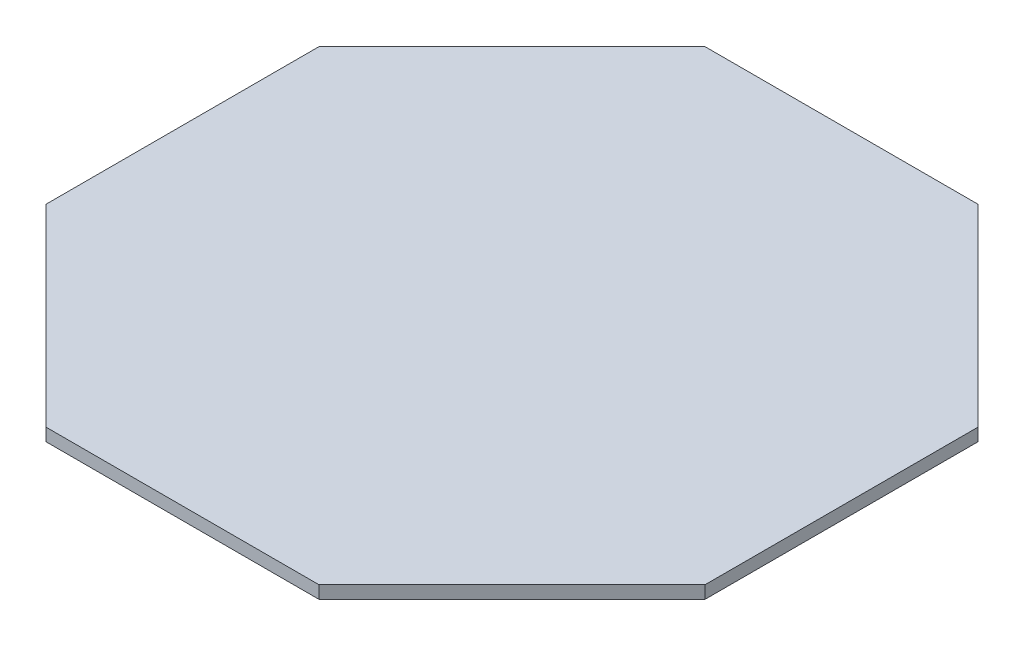
ISO-10303-21;
HEADER;
FILE_DESCRIPTION(('STEP AP214'),'2;1');
FILE_NAME('part.step','',(''),(''),'','','');
FILE_SCHEMA(('AUTOMOTIVE_DESIGN { 1 0 10303 214 1 1 1 1 }'));
ENDSEC;
DATA;
#1=APPLICATION_CONTEXT('core data for automotive mechanical design processes');
#2=APPLICATION_PROTOCOL_DEFINITION('international standard','automotive_design',2000,#1);
#3=PRODUCT_CONTEXT('',#1,'mechanical');
#4=PRODUCT('Part','Part','',(#3));
#5=PRODUCT_RELATED_PRODUCT_CATEGORY('part','',(#4));
#6=PRODUCT_DEFINITION_FORMATION('','',#4);
#7=PRODUCT_DEFINITION_CONTEXT('part definition',#1,'design');
#8=PRODUCT_DEFINITION('design','',#6,#7);
#9=PRODUCT_DEFINITION_SHAPE('','',#8);
#10=(LENGTH_UNIT() NAMED_UNIT(*) SI_UNIT(.MILLI.,.METRE.));
#11=(NAMED_UNIT(*) PLANE_ANGLE_UNIT() SI_UNIT($,.RADIAN.));
#12=(NAMED_UNIT(*) SI_UNIT($,.STERADIAN.) SOLID_ANGLE_UNIT());
#13=UNCERTAINTY_MEASURE_WITH_UNIT(LENGTH_MEASURE(1.E-05),#10,'distance_accuracy_value','');
#14=(GEOMETRIC_REPRESENTATION_CONTEXT(3) GLOBAL_UNCERTAINTY_ASSIGNED_CONTEXT((#13)) GLOBAL_UNIT_ASSIGNED_CONTEXT((#10,
#11,#12)) REPRESENTATION_CONTEXT('',''));
#15=CARTESIAN_POINT('',(0.,0.,0.));
#16=DIRECTION('',(0.,0.,1.));
#17=DIRECTION('',(1.,0.,0.));
#18=AXIS2_PLACEMENT_3D('',#15,#16,#17);
#19=CARTESIAN_POINT('',(78.0000000000003,-3.,32.3086578651015));
#20=DIRECTION('',(1.,0.,0.));
#21=DIRECTION('',(0.,0.,-1.));
#22=AXIS2_PLACEMENT_3D('',#19,#20,#21);
#23=PLANE('',#22);
#24=DIRECTION('',(0.,0.,-1.));
#25=VECTOR('',#24,1.);
#26=CARTESIAN_POINT('',(78.0000000000003,0.,32.3086578651015));
#27=LINE('',#26,#25);
#28=CARTESIAN_POINT('',(78.0000000000003,0.,32.3086578651015));
#29=VERTEX_POINT('',#28);
#30=CARTESIAN_POINT('',(78.0000000000003,0.,-32.3086578651015));
#31=VERTEX_POINT('',#30);
#32=EDGE_CURVE('E130',#29,#31,#27,.T.);
#33=ORIENTED_EDGE('',*,*,#32,.F.);
#34=DIRECTION('',(0.,1.,0.));
#35=VECTOR('',#34,1.);
#36=CARTESIAN_POINT('',(78.0000000000003,-3.,32.3086578651015));
#37=LINE('',#36,#35);
#38=CARTESIAN_POINT('',(78.0000000000003,-3.,32.3086578651015));
#39=VERTEX_POINT('',#38);
#40=EDGE_CURVE('E11',#39,#29,#37,.T.);
#41=ORIENTED_EDGE('',*,*,#40,.F.);
#42=DIRECTION('',(0.,0.,-1.));
#43=VECTOR('',#42,1.);
#44=CARTESIAN_POINT('',(78.0000000000003,-3.,32.3086578651015));
#45=LINE('',#44,#43);
#46=CARTESIAN_POINT('',(78.0000000000003,-3.,-32.3086578651015));
#47=VERTEX_POINT('',#46);
#48=EDGE_CURVE('E150',#39,#47,#45,.T.);
#49=ORIENTED_EDGE('',*,*,#48,.T.);
#50=DIRECTION('',(0.,1.,0.));
#51=VECTOR('',#50,1.);
#52=CARTESIAN_POINT('',(78.0000000000003,-3.,-32.3086578651015));
#53=LINE('',#52,#51);
#54=EDGE_CURVE('E36',#47,#31,#53,.T.);
#55=ORIENTED_EDGE('',*,*,#54,.T.);
#56=EDGE_LOOP('',(#33,#41,#49,#55));
#57=FACE_BOUND('',#56,.T.);
#58=ADVANCED_FACE('F33',(#57),#23,.T.);
#59=CARTESIAN_POINT('',(32.3086578651015,-3.,78.0000000000003));
#60=DIRECTION('',(0.707106781186547,0.,0.707106781186547));
#61=DIRECTION('',(0.707106781186548,0.,-0.707106781186548));
#62=AXIS2_PLACEMENT_3D('',#59,#60,#61);
#63=PLANE('',#62);
#64=DIRECTION('',(0.707106781186548,0.,-0.707106781186548));
#65=VECTOR('',#64,1.);
#66=CARTESIAN_POINT('',(32.3086578651015,0.,78.0000000000003));
#67=LINE('',#66,#65);
#68=CARTESIAN_POINT('',(32.3086578651015,0.,78.0000000000003));
#69=VERTEX_POINT('',#68);
#70=EDGE_CURVE('E148',#69,#29,#67,.T.);
#71=ORIENTED_EDGE('',*,*,#70,.F.);
#72=DIRECTION('',(0.,1.,0.));
#73=VECTOR('',#72,1.);
#74=CARTESIAN_POINT('',(32.3086578651015,-3.,78.0000000000003));
#75=LINE('',#74,#73);
#76=CARTESIAN_POINT('',(32.3086578651015,-3.,78.0000000000003));
#77=VERTEX_POINT('',#76);
#78=EDGE_CURVE('E42',#77,#69,#75,.T.);
#79=ORIENTED_EDGE('',*,*,#78,.F.);
#80=DIRECTION('',(0.707106781186548,0.,-0.707106781186548));
#81=VECTOR('',#80,1.);
#82=CARTESIAN_POINT('',(32.3086578651015,-3.,78.0000000000003));
#83=LINE('',#82,#81);
#84=EDGE_CURVE('E120',#77,#39,#83,.T.);
#85=ORIENTED_EDGE('',*,*,#84,.T.);
#86=ORIENTED_EDGE('',*,*,#40,.T.);
#87=EDGE_LOOP('',(#71,#79,#85,#86));
#88=FACE_BOUND('',#87,.T.);
#89=ADVANCED_FACE('F162',(#88),#63,.T.);
#90=CARTESIAN_POINT('',(-32.3086578651015,-3.,78.0000000000003));
#91=DIRECTION('',(0.,0.,1.));
#92=DIRECTION('',(1.,0.,0.));
#93=AXIS2_PLACEMENT_3D('',#90,#91,#92);
#94=PLANE('',#93);
#95=DIRECTION('',(1.,0.,0.));
#96=VECTOR('',#95,1.);
#97=CARTESIAN_POINT('',(-32.3086578651015,0.,78.0000000000003));
#98=LINE('',#97,#96);
#99=CARTESIAN_POINT('',(-32.3086578651015,0.,78.0000000000003));
#100=VERTEX_POINT('',#99);
#101=EDGE_CURVE('E107',#100,#69,#98,.T.);
#102=ORIENTED_EDGE('',*,*,#101,.F.);
#103=DIRECTION('',(0.,1.,0.));
#104=VECTOR('',#103,1.);
#105=CARTESIAN_POINT('',(-32.3086578651015,-3.,78.0000000000003));
#106=LINE('',#105,#104);
#107=CARTESIAN_POINT('',(-32.3086578651015,-3.,78.0000000000003));
#108=VERTEX_POINT('',#107);
#109=EDGE_CURVE('E102',#108,#100,#106,.T.);
#110=ORIENTED_EDGE('',*,*,#109,.F.);
#111=DIRECTION('',(1.,0.,0.));
#112=VECTOR('',#111,1.);
#113=CARTESIAN_POINT('',(-32.3086578651015,-3.,78.0000000000003));
#114=LINE('',#113,#112);
#115=EDGE_CURVE('E105',#108,#77,#114,.T.);
#116=ORIENTED_EDGE('',*,*,#115,.T.);
#117=ORIENTED_EDGE('',*,*,#78,.T.);
#118=EDGE_LOOP('',(#102,#110,#116,#117));
#119=FACE_BOUND('',#118,.T.);
#120=ADVANCED_FACE('F104',(#119),#94,.T.);
#121=CARTESIAN_POINT('',(-78.0000000000003,-3.,32.3086578651015));
#122=DIRECTION('',(-0.707106781186547,0.,0.707106781186548));
#123=DIRECTION('',(0.707106781186548,0.,0.707106781186547));
#124=AXIS2_PLACEMENT_3D('',#121,#122,#123);
#125=PLANE('',#124);
#126=DIRECTION('',(0.707106781186548,0.,0.707106781186548));
#127=VECTOR('',#126,1.);
#128=CARTESIAN_POINT('',(-78.0000000000003,0.,32.3086578651015));
#129=LINE('',#128,#127);
#130=CARTESIAN_POINT('',(-78.0000000000003,0.,32.3086578651015));
#131=VERTEX_POINT('',#130);
#132=EDGE_CURVE('E145',#131,#100,#129,.T.);
#133=ORIENTED_EDGE('',*,*,#132,.F.);
#134=DIRECTION('',(0.,1.,0.));
#135=VECTOR('',#134,1.);
#136=CARTESIAN_POINT('',(-78.0000000000003,-3.,32.3086578651015));
#137=LINE('',#136,#135);
#138=CARTESIAN_POINT('',(-78.0000000000003,-3.,32.3086578651015));
#139=VERTEX_POINT('',#138);
#140=EDGE_CURVE('E112',#139,#131,#137,.T.);
#141=ORIENTED_EDGE('',*,*,#140,.F.);
#142=DIRECTION('',(0.707106781186548,0.,0.707106781186548));
#143=VECTOR('',#142,1.);
#144=CARTESIAN_POINT('',(-78.0000000000003,-3.,32.3086578651015));
#145=LINE('',#144,#143);
#146=EDGE_CURVE('E118',#139,#108,#145,.T.);
#147=ORIENTED_EDGE('',*,*,#146,.T.);
#148=ORIENTED_EDGE('',*,*,#109,.T.);
#149=EDGE_LOOP('',(#133,#141,#147,#148));
#150=FACE_BOUND('',#149,.T.);
#151=ADVANCED_FACE('F122',(#150),#125,.T.);
#152=CARTESIAN_POINT('',(-78.0000000000003,-3.,-32.3086578651015));
#153=DIRECTION('',(-1.,0.,0.));
#154=DIRECTION('',(0.,0.,1.));
#155=AXIS2_PLACEMENT_3D('',#152,#153,#154);
#156=PLANE('',#155);
#157=DIRECTION('',(0.,0.,1.));
#158=VECTOR('',#157,1.);
#159=CARTESIAN_POINT('',(-78.0000000000003,0.,-32.3086578651015));
#160=LINE('',#159,#158);
#161=CARTESIAN_POINT('',(-78.0000000000003,0.,-32.3086578651015));
#162=VERTEX_POINT('',#161);
#163=EDGE_CURVE('E142',#162,#131,#160,.T.);
#164=ORIENTED_EDGE('',*,*,#163,.F.);
#165=DIRECTION('',(0.,1.,0.));
#166=VECTOR('',#165,1.);
#167=CARTESIAN_POINT('',(-78.0000000000003,-3.,-32.3086578651015));
#168=LINE('',#167,#166);
#169=CARTESIAN_POINT('',(-78.0000000000003,-3.,-32.3086578651015));
#170=VERTEX_POINT('',#169);
#171=EDGE_CURVE('E154',#170,#162,#168,.T.);
#172=ORIENTED_EDGE('',*,*,#171,.F.);
#173=DIRECTION('',(0.,0.,1.));
#174=VECTOR('',#173,1.);
#175=CARTESIAN_POINT('',(-78.0000000000003,-3.,-32.3086578651015));
#176=LINE('',#175,#174);
#177=EDGE_CURVE('E123',#170,#139,#176,.T.);
#178=ORIENTED_EDGE('',*,*,#177,.T.);
#179=ORIENTED_EDGE('',*,*,#140,.T.);
#180=EDGE_LOOP('',(#164,#172,#178,#179));
#181=FACE_BOUND('',#180,.T.);
#182=ADVANCED_FACE('F175',(#181),#156,.T.);
#183=CARTESIAN_POINT('',(-32.3086578651015,-3.,-78.0000000000003));
#184=DIRECTION('',(-0.707106781186548,0.,-0.707106781186547));
#185=DIRECTION('',(-0.707106781186547,0.,0.707106781186548));
#186=AXIS2_PLACEMENT_3D('',#183,#184,#185);
#187=PLANE('',#186);
#188=DIRECTION('',(-0.707106781186547,0.,0.707106781186548));
#189=VECTOR('',#188,1.);
#190=CARTESIAN_POINT('',(-32.3086578651015,0.,-78.0000000000003));
#191=LINE('',#190,#189);
#192=CARTESIAN_POINT('',(-32.3086578651015,0.,-78.0000000000003));
#193=VERTEX_POINT('',#192);
#194=EDGE_CURVE('E139',#193,#162,#191,.T.);
#195=ORIENTED_EDGE('',*,*,#194,.F.);
#196=DIRECTION('',(0.,1.,0.));
#197=VECTOR('',#196,1.);
#198=CARTESIAN_POINT('',(-32.3086578651015,-3.,-78.0000000000003));
#199=LINE('',#198,#197);
#200=CARTESIAN_POINT('',(-32.3086578651015,-3.,-78.0000000000003));
#201=VERTEX_POINT('',#200);
#202=EDGE_CURVE('E156',#201,#193,#199,.T.);
#203=ORIENTED_EDGE('',*,*,#202,.F.);
#204=DIRECTION('',(-0.707106781186547,0.,0.707106781186548));
#205=VECTOR('',#204,1.);
#206=CARTESIAN_POINT('',(-32.3086578651015,-3.,-78.0000000000003));
#207=LINE('',#206,#205);
#208=EDGE_CURVE('E125',#201,#170,#207,.T.);
#209=ORIENTED_EDGE('',*,*,#208,.T.);
#210=ORIENTED_EDGE('',*,*,#171,.T.);
#211=EDGE_LOOP('',(#195,#203,#209,#210));
#212=FACE_BOUND('',#211,.T.);
#213=ADVANCED_FACE('F178',(#212),#187,.T.);
#214=CARTESIAN_POINT('',(32.3086578651015,-3.,-78.0000000000003));
#215=DIRECTION('',(0.,0.,-1.));
#216=DIRECTION('',(-1.,0.,0.));
#217=AXIS2_PLACEMENT_3D('',#214,#215,#216);
#218=PLANE('',#217);
#219=DIRECTION('',(-1.,0.,0.));
#220=VECTOR('',#219,1.);
#221=CARTESIAN_POINT('',(32.3086578651015,0.,-78.0000000000003));
#222=LINE('',#221,#220);
#223=CARTESIAN_POINT('',(32.3086578651015,0.,-78.0000000000003));
#224=VERTEX_POINT('',#223);
#225=EDGE_CURVE('E136',#224,#193,#222,.T.);
#226=ORIENTED_EDGE('',*,*,#225,.F.);
#227=DIRECTION('',(0.,1.,0.));
#228=VECTOR('',#227,1.);
#229=CARTESIAN_POINT('',(32.3086578651015,-3.,-78.0000000000003));
#230=LINE('',#229,#228);
#231=CARTESIAN_POINT('',(32.3086578651015,-3.,-78.0000000000003));
#232=VERTEX_POINT('',#231);
#233=EDGE_CURVE('E157',#232,#224,#230,.T.);
#234=ORIENTED_EDGE('',*,*,#233,.F.);
#235=DIRECTION('',(-1.,0.,0.));
#236=VECTOR('',#235,1.);
#237=CARTESIAN_POINT('',(32.3086578651015,-3.,-78.0000000000003));
#238=LINE('',#237,#236);
#239=EDGE_CURVE('E253',#232,#201,#238,.T.);
#240=ORIENTED_EDGE('',*,*,#239,.T.);
#241=ORIENTED_EDGE('',*,*,#202,.T.);
#242=EDGE_LOOP('',(#226,#234,#240,#241));
#243=FACE_BOUND('',#242,.T.);
#244=ADVANCED_FACE('F182',(#243),#218,.T.);
#245=CARTESIAN_POINT('',(78.0000000000003,-3.,-32.3086578651015));
#246=DIRECTION('',(0.707106781186547,0.,-0.707106781186548));
#247=DIRECTION('',(-0.707106781186548,0.,-0.707106781186547));
#248=AXIS2_PLACEMENT_3D('',#245,#246,#247);
#249=PLANE('',#248);
#250=DIRECTION('',(-0.707106781186548,0.,-0.707106781186547));
#251=VECTOR('',#250,1.);
#252=CARTESIAN_POINT('',(78.0000000000003,0.,-32.3086578651015));
#253=LINE('',#252,#251);
#254=EDGE_CURVE('E133',#31,#224,#253,.T.);
#255=ORIENTED_EDGE('',*,*,#254,.F.);
#256=ORIENTED_EDGE('',*,*,#54,.F.);
#257=DIRECTION('',(-0.707106781186548,0.,-0.707106781186547));
#258=VECTOR('',#257,1.);
#259=CARTESIAN_POINT('',(78.0000000000003,-3.,-32.3086578651015));
#260=LINE('',#259,#258);
#261=EDGE_CURVE('E254',#47,#232,#260,.T.);
#262=ORIENTED_EDGE('',*,*,#261,.T.);
#263=ORIENTED_EDGE('',*,*,#233,.T.);
#264=EDGE_LOOP('',(#255,#256,#262,#263));
#265=FACE_BOUND('',#264,.T.);
#266=ADVANCED_FACE('F159',(#265),#249,.T.);
#267=CARTESIAN_POINT('',(0.,-3.,0.));
#268=DIRECTION('',(0.,1.,0.));
#269=DIRECTION('',(0.,0.,1.));
#270=AXIS2_PLACEMENT_3D('',#267,#268,#269);
#271=PLANE('',#270);
#272=ORIENTED_EDGE('',*,*,#48,.F.);
#273=ORIENTED_EDGE('',*,*,#84,.F.);
#274=ORIENTED_EDGE('',*,*,#115,.F.);
#275=ORIENTED_EDGE('',*,*,#146,.F.);
#276=ORIENTED_EDGE('',*,*,#177,.F.);
#277=ORIENTED_EDGE('',*,*,#208,.F.);
#278=ORIENTED_EDGE('',*,*,#239,.F.);
#279=ORIENTED_EDGE('',*,*,#261,.F.);
#280=EDGE_LOOP('',(#272,#273,#274,#275,#276,#277,#278,#279));
#281=FACE_BOUND('',#280,.T.);
#282=ADVANCED_FACE('F116',(#281),#271,.F.);
#283=CARTESIAN_POINT('',(0.,0.,0.));
#284=DIRECTION('',(0.,1.,0.));
#285=DIRECTION('',(0.,0.,1.));
#286=AXIS2_PLACEMENT_3D('',#283,#284,#285);
#287=PLANE('',#286);
#288=ORIENTED_EDGE('',*,*,#32,.T.);
#289=ORIENTED_EDGE('',*,*,#254,.T.);
#290=ORIENTED_EDGE('',*,*,#225,.T.);
#291=ORIENTED_EDGE('',*,*,#194,.T.);
#292=ORIENTED_EDGE('',*,*,#163,.T.);
#293=ORIENTED_EDGE('',*,*,#132,.T.);
#294=ORIENTED_EDGE('',*,*,#101,.T.);
#295=ORIENTED_EDGE('',*,*,#70,.T.);
#296=EDGE_LOOP('',(#288,#289,#290,#291,#292,#293,#294,#295));
#297=FACE_BOUND('',#296,.T.);
#298=ADVANCED_FACE('F161',(#297),#287,.T.);
#299=CLOSED_SHELL('',(#58,#89,#120,#151,#182,#213,#244,#266,#282,#298));
#300=MANIFOLD_SOLID_BREP('B2',#299);
#301=ADVANCED_BREP_SHAPE_REPRESENTATION('',(#18,#300),#14);
#302=SHAPE_DEFINITION_REPRESENTATION(#9,#301);
ENDSEC;
END-ISO-10303-21;
